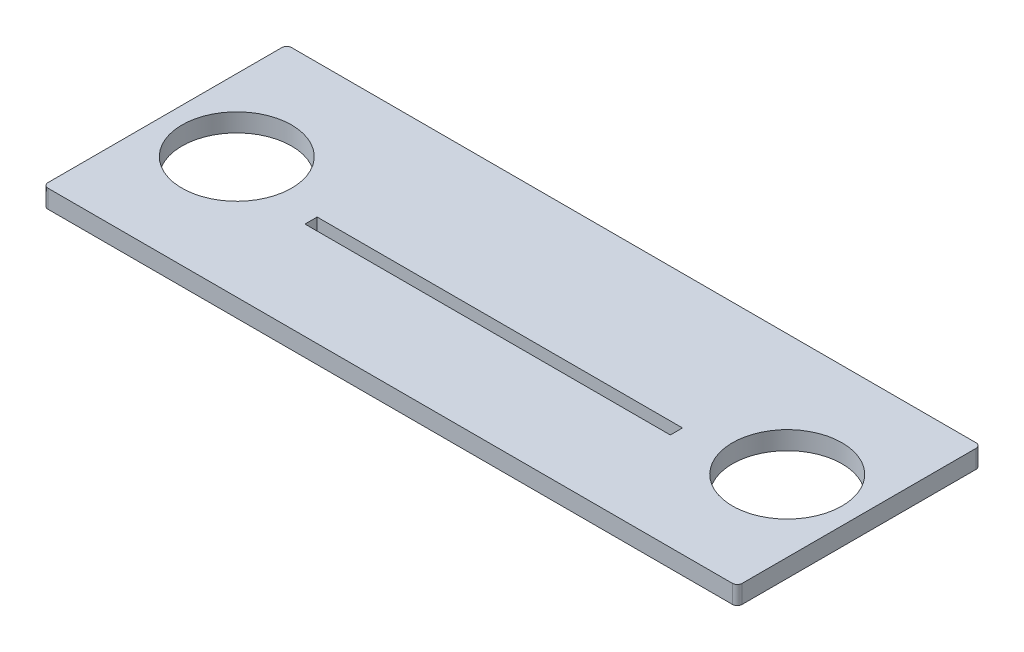
ISO-10303-21;
HEADER;
FILE_DESCRIPTION(('STEP AP214'),'2;1');
FILE_NAME('part.step','',(''),(''),'','','');
FILE_SCHEMA(('AUTOMOTIVE_DESIGN { 1 0 10303 214 1 1 1 1 }'));
ENDSEC;
DATA;
#1=APPLICATION_CONTEXT('core data for automotive mechanical design processes');
#2=APPLICATION_PROTOCOL_DEFINITION('international standard','automotive_design',2000,#1);
#3=PRODUCT_CONTEXT('',#1,'mechanical');
#4=PRODUCT('Part','Part','',(#3));
#5=PRODUCT_RELATED_PRODUCT_CATEGORY('part','',(#4));
#6=PRODUCT_DEFINITION_FORMATION('','',#4);
#7=PRODUCT_DEFINITION_CONTEXT('part definition',#1,'design');
#8=PRODUCT_DEFINITION('design','',#6,#7);
#9=PRODUCT_DEFINITION_SHAPE('','',#8);
#10=(LENGTH_UNIT() NAMED_UNIT(*) SI_UNIT(.MILLI.,.METRE.));
#11=(NAMED_UNIT(*) PLANE_ANGLE_UNIT() SI_UNIT($,.RADIAN.));
#12=(NAMED_UNIT(*) SI_UNIT($,.STERADIAN.) SOLID_ANGLE_UNIT());
#13=UNCERTAINTY_MEASURE_WITH_UNIT(LENGTH_MEASURE(1.E-05),#10,'distance_accuracy_value','');
#14=(GEOMETRIC_REPRESENTATION_CONTEXT(3) GLOBAL_UNCERTAINTY_ASSIGNED_CONTEXT((#13)) GLOBAL_UNIT_ASSIGNED_CONTEXT((#10,
#11,#12)) REPRESENTATION_CONTEXT('',''));
#15=CARTESIAN_POINT('',(0.,0.,0.));
#16=DIRECTION('',(0.,0.,1.));
#17=DIRECTION('',(1.,0.,0.));
#18=AXIS2_PLACEMENT_3D('',#15,#16,#17);
#19=CARTESIAN_POINT('',(0.,7.5,0.));
#20=DIRECTION('',(0.,-1.,0.));
#21=DIRECTION('',(0.,0.,-1.));
#22=AXIS2_PLACEMENT_3D('',#19,#20,#21);
#23=PLANE('',#22);
#24=CARTESIAN_POINT('',(113.,7.5,0.));
#25=DIRECTION('',(0.,-1.,0.));
#26=DIRECTION('',(0.,0.,-1.));
#27=AXIS2_PLACEMENT_3D('',#24,#25,#26);
#28=CIRCLE('',#27,22.5);
#29=CARTESIAN_POINT('',(113.,7.5,-22.5));
#30=VERTEX_POINT('',#29);
#31=EDGE_CURVE('E168',#30,#30,#28,.F.);
#32=ORIENTED_EDGE('',*,*,#31,.F.);
#33=EDGE_LOOP('',(#32));
#34=FACE_BOUND('',#33,.T.);
#35=CARTESIAN_POINT('',(-113.,7.5,0.));
#36=DIRECTION('',(0.,-1.,0.));
#37=DIRECTION('',(0.,0.,-1.));
#38=AXIS2_PLACEMENT_3D('',#35,#36,#37);
#39=CIRCLE('',#38,22.5);
#40=CARTESIAN_POINT('',(-113.,7.5,-22.5));
#41=VERTEX_POINT('',#40);
#42=EDGE_CURVE('E224',#41,#41,#39,.F.);
#43=ORIENTED_EDGE('',*,*,#42,.F.);
#44=EDGE_LOOP('',(#43));
#45=FACE_BOUND('',#44,.T.);
#46=DIRECTION('',(0.,0.,-1.));
#47=VECTOR('',#46,1.);
#48=CARTESIAN_POINT('',(142.5,7.5,50.));
#49=LINE('',#48,#47);
#50=CARTESIAN_POINT('',(142.5,7.5,48.));
#51=VERTEX_POINT('',#50);
#52=CARTESIAN_POINT('',(142.5,7.5,-48.));
#53=VERTEX_POINT('',#52);
#54=EDGE_CURVE('E217',#51,#53,#49,.T.);
#55=ORIENTED_EDGE('',*,*,#54,.T.);
#56=CARTESIAN_POINT('',(140.5,7.5,-48.));
#57=DIRECTION('',(0.,-1.,0.));
#58=DIRECTION('',(0.,0.,-1.));
#59=AXIS2_PLACEMENT_3D('',#56,#57,#58);
#60=CIRCLE('',#59,2.);
#61=CARTESIAN_POINT('',(140.5,7.5,-50.));
#62=VERTEX_POINT('',#61);
#63=EDGE_CURVE('E192',#53,#62,#60,.F.);
#64=ORIENTED_EDGE('',*,*,#63,.T.);
#65=DIRECTION('',(-1.,0.,0.));
#66=VECTOR('',#65,1.);
#67=CARTESIAN_POINT('',(-142.5,7.5,-50.));
#68=LINE('',#67,#66);
#69=CARTESIAN_POINT('',(-140.5,7.5,-50.));
#70=VERTEX_POINT('',#69);
#71=EDGE_CURVE('E246',#62,#70,#68,.T.);
#72=ORIENTED_EDGE('',*,*,#71,.T.);
#73=CARTESIAN_POINT('',(-140.5,7.5,-48.));
#74=DIRECTION('',(0.,-1.,0.));
#75=DIRECTION('',(0.,0.,-1.));
#76=AXIS2_PLACEMENT_3D('',#73,#74,#75);
#77=CIRCLE('',#76,2.);
#78=CARTESIAN_POINT('',(-142.5,7.5,-48.));
#79=VERTEX_POINT('',#78);
#80=EDGE_CURVE('E187',#70,#79,#77,.F.);
#81=ORIENTED_EDGE('',*,*,#80,.T.);
#82=DIRECTION('',(0.,0.,1.));
#83=VECTOR('',#82,1.);
#84=CARTESIAN_POINT('',(-142.5,7.5,50.));
#85=LINE('',#84,#83);
#86=CARTESIAN_POINT('',(-142.5,7.5,48.));
#87=VERTEX_POINT('',#86);
#88=EDGE_CURVE('E206',#79,#87,#85,.T.);
#89=ORIENTED_EDGE('',*,*,#88,.T.);
#90=CARTESIAN_POINT('',(-140.5,7.5,48.));
#91=DIRECTION('',(0.,-1.,0.));
#92=DIRECTION('',(0.,0.,-1.));
#93=AXIS2_PLACEMENT_3D('',#90,#91,#92);
#94=CIRCLE('',#93,2.);
#95=CARTESIAN_POINT('',(-140.5,7.5,50.));
#96=VERTEX_POINT('',#95);
#97=EDGE_CURVE('E65',#87,#96,#94,.F.);
#98=ORIENTED_EDGE('',*,*,#97,.T.);
#99=DIRECTION('',(1.,0.,0.));
#100=VECTOR('',#99,1.);
#101=CARTESIAN_POINT('',(-142.5,7.5,50.));
#102=LINE('',#101,#100);
#103=CARTESIAN_POINT('',(140.5,7.5,50.));
#104=VERTEX_POINT('',#103);
#105=EDGE_CURVE('E144',#96,#104,#102,.T.);
#106=ORIENTED_EDGE('',*,*,#105,.T.);
#107=CARTESIAN_POINT('',(140.5,7.5,48.));
#108=DIRECTION('',(0.,-1.,0.));
#109=DIRECTION('',(0.,0.,-1.));
#110=AXIS2_PLACEMENT_3D('',#107,#108,#109);
#111=CIRCLE('',#110,2.);
#112=EDGE_CURVE('E190',#104,#51,#111,.F.);
#113=ORIENTED_EDGE('',*,*,#112,.T.);
#114=EDGE_LOOP('',(#55,#64,#72,#81,#89,#98,#106,#113));
#115=FACE_BOUND('',#114,.T.);
#116=DIRECTION('',(0.,0.,-1.));
#117=VECTOR('',#116,1.);
#118=CARTESIAN_POINT('',(-75.,7.5,0.));
#119=LINE('',#118,#117);
#120=CARTESIAN_POINT('',(-75.,7.5,10.));
#121=VERTEX_POINT('',#120);
#122=CARTESIAN_POINT('',(-75.,7.5,5.));
#123=VERTEX_POINT('',#122);
#124=EDGE_CURVE('E237',#121,#123,#119,.T.);
#125=ORIENTED_EDGE('',*,*,#124,.T.);
#126=DIRECTION('',(1.,0.,0.));
#127=VECTOR('',#126,1.);
#128=CARTESIAN_POINT('',(0.,7.5,5.));
#129=LINE('',#128,#127);
#130=CARTESIAN_POINT('',(75.,7.5,5.));
#131=VERTEX_POINT('',#130);
#132=EDGE_CURVE('E169',#123,#131,#129,.T.);
#133=ORIENTED_EDGE('',*,*,#132,.T.);
#134=DIRECTION('',(0.,0.,-1.));
#135=VECTOR('',#134,1.);
#136=CARTESIAN_POINT('',(75.,7.5,0.));
#137=LINE('',#136,#135);
#138=CARTESIAN_POINT('',(75.,7.5,10.));
#139=VERTEX_POINT('',#138);
#140=EDGE_CURVE('E227',#139,#131,#137,.T.);
#141=ORIENTED_EDGE('',*,*,#140,.F.);
#142=DIRECTION('',(1.,0.,0.));
#143=VECTOR('',#142,1.);
#144=CARTESIAN_POINT('',(0.,7.5,10.));
#145=LINE('',#144,#143);
#146=EDGE_CURVE('E151',#121,#139,#145,.T.);
#147=ORIENTED_EDGE('',*,*,#146,.F.);
#148=EDGE_LOOP('',(#125,#133,#141,#147));
#149=FACE_BOUND('',#148,.T.);
#150=ADVANCED_FACE('F43',(#34,#45,#115,#149),#23,.F.);
#151=CARTESIAN_POINT('',(0.,0.,0.));
#152=DIRECTION('',(0.,-1.,0.));
#153=DIRECTION('',(0.,0.,-1.));
#154=AXIS2_PLACEMENT_3D('',#151,#152,#153);
#155=PLANE('',#154);
#156=CARTESIAN_POINT('',(113.,0.,0.));
#157=DIRECTION('',(0.,-1.,0.));
#158=DIRECTION('',(0.,0.,-1.));
#159=AXIS2_PLACEMENT_3D('',#156,#157,#158);
#160=CIRCLE('',#159,22.5);
#161=CARTESIAN_POINT('',(113.,0.,-22.5));
#162=VERTEX_POINT('',#161);
#163=EDGE_CURVE('E165',#162,#162,#160,.F.);
#164=ORIENTED_EDGE('',*,*,#163,.T.);
#165=EDGE_LOOP('',(#164));
#166=FACE_BOUND('',#165,.T.);
#167=DIRECTION('',(-1.,0.,0.));
#168=VECTOR('',#167,1.);
#169=CARTESIAN_POINT('',(-142.5,0.,-50.));
#170=LINE('',#169,#168);
#171=CARTESIAN_POINT('',(140.5,0.,-50.));
#172=VERTEX_POINT('',#171);
#173=CARTESIAN_POINT('',(-140.5,0.,-50.));
#174=VERTEX_POINT('',#173);
#175=EDGE_CURVE('E215',#172,#174,#170,.T.);
#176=ORIENTED_EDGE('',*,*,#175,.F.);
#177=CARTESIAN_POINT('',(140.5,0.,-48.));
#178=DIRECTION('',(0.,-1.,0.));
#179=DIRECTION('',(0.,0.,-1.));
#180=AXIS2_PLACEMENT_3D('',#177,#178,#179);
#181=CIRCLE('',#180,2.);
#182=CARTESIAN_POINT('',(142.5,0.,-48.));
#183=VERTEX_POINT('',#182);
#184=EDGE_CURVE('E180',#172,#183,#181,.T.);
#185=ORIENTED_EDGE('',*,*,#184,.T.);
#186=DIRECTION('',(0.,0.,-1.));
#187=VECTOR('',#186,1.);
#188=CARTESIAN_POINT('',(142.5,0.,50.));
#189=LINE('',#188,#187);
#190=CARTESIAN_POINT('',(142.5,0.,48.));
#191=VERTEX_POINT('',#190);
#192=EDGE_CURVE('E219',#191,#183,#189,.T.);
#193=ORIENTED_EDGE('',*,*,#192,.F.);
#194=CARTESIAN_POINT('',(140.5,0.,48.));
#195=DIRECTION('',(0.,-1.,0.));
#196=DIRECTION('',(0.,0.,-1.));
#197=AXIS2_PLACEMENT_3D('',#194,#195,#196);
#198=CIRCLE('',#197,2.);
#199=CARTESIAN_POINT('',(140.5,0.,50.));
#200=VERTEX_POINT('',#199);
#201=EDGE_CURVE('E178',#191,#200,#198,.T.);
#202=ORIENTED_EDGE('',*,*,#201,.T.);
#203=DIRECTION('',(1.,0.,0.));
#204=VECTOR('',#203,1.);
#205=CARTESIAN_POINT('',(-142.5,0.,50.));
#206=LINE('',#205,#204);
#207=CARTESIAN_POINT('',(-140.5,0.,50.));
#208=VERTEX_POINT('',#207);
#209=EDGE_CURVE('E214',#208,#200,#206,.T.);
#210=ORIENTED_EDGE('',*,*,#209,.F.);
#211=CARTESIAN_POINT('',(-140.5,0.,48.));
#212=DIRECTION('',(0.,-1.,0.));
#213=DIRECTION('',(0.,0.,-1.));
#214=AXIS2_PLACEMENT_3D('',#211,#212,#213);
#215=CIRCLE('',#214,2.);
#216=CARTESIAN_POINT('',(-142.5,0.,48.));
#217=VERTEX_POINT('',#216);
#218=EDGE_CURVE('E176',#208,#217,#215,.T.);
#219=ORIENTED_EDGE('',*,*,#218,.T.);
#220=DIRECTION('',(0.,0.,1.));
#221=VECTOR('',#220,1.);
#222=CARTESIAN_POINT('',(-142.5,0.,50.));
#223=LINE('',#222,#221);
#224=CARTESIAN_POINT('',(-142.5,0.,-48.));
#225=VERTEX_POINT('',#224);
#226=EDGE_CURVE('E204',#225,#217,#223,.T.);
#227=ORIENTED_EDGE('',*,*,#226,.F.);
#228=CARTESIAN_POINT('',(-140.5,0.,-48.));
#229=DIRECTION('',(0.,-1.,0.));
#230=DIRECTION('',(0.,0.,-1.));
#231=AXIS2_PLACEMENT_3D('',#228,#229,#230);
#232=CIRCLE('',#231,2.);
#233=EDGE_CURVE('E174',#225,#174,#232,.T.);
#234=ORIENTED_EDGE('',*,*,#233,.T.);
#235=EDGE_LOOP('',(#176,#185,#193,#202,#210,#219,#227,#234));
#236=FACE_BOUND('',#235,.T.);
#237=CARTESIAN_POINT('',(-113.,0.,0.));
#238=DIRECTION('',(0.,-1.,0.));
#239=DIRECTION('',(0.,0.,-1.));
#240=AXIS2_PLACEMENT_3D('',#237,#238,#239);
#241=CIRCLE('',#240,22.5);
#242=CARTESIAN_POINT('',(-113.,0.,-22.5));
#243=VERTEX_POINT('',#242);
#244=EDGE_CURVE('E222',#243,#243,#241,.F.);
#245=ORIENTED_EDGE('',*,*,#244,.T.);
#246=EDGE_LOOP('',(#245));
#247=FACE_BOUND('',#246,.T.);
#248=DIRECTION('',(1.,0.,0.));
#249=VECTOR('',#248,1.);
#250=CARTESIAN_POINT('',(0.,0.,5.));
#251=LINE('',#250,#249);
#252=CARTESIAN_POINT('',(-75.,0.,5.));
#253=VERTEX_POINT('',#252);
#254=CARTESIAN_POINT('',(75.,0.,5.));
#255=VERTEX_POINT('',#254);
#256=EDGE_CURVE('E159',#253,#255,#251,.T.);
#257=ORIENTED_EDGE('',*,*,#256,.F.);
#258=DIRECTION('',(0.,0.,-1.));
#259=VECTOR('',#258,1.);
#260=CARTESIAN_POINT('',(-75.,0.,0.));
#261=LINE('',#260,#259);
#262=CARTESIAN_POINT('',(-75.,0.,10.));
#263=VERTEX_POINT('',#262);
#264=EDGE_CURVE('E157',#263,#253,#261,.T.);
#265=ORIENTED_EDGE('',*,*,#264,.F.);
#266=DIRECTION('',(1.,0.,0.));
#267=VECTOR('',#266,1.);
#268=CARTESIAN_POINT('',(0.,0.,10.));
#269=LINE('',#268,#267);
#270=CARTESIAN_POINT('',(75.,0.,10.));
#271=VERTEX_POINT('',#270);
#272=EDGE_CURVE('E143',#263,#271,#269,.T.);
#273=ORIENTED_EDGE('',*,*,#272,.T.);
#274=DIRECTION('',(0.,0.,-1.));
#275=VECTOR('',#274,1.);
#276=CARTESIAN_POINT('',(75.,0.,0.));
#277=LINE('',#276,#275);
#278=EDGE_CURVE('E132',#271,#255,#277,.T.);
#279=ORIENTED_EDGE('',*,*,#278,.T.);
#280=EDGE_LOOP('',(#257,#265,#273,#279));
#281=FACE_BOUND('',#280,.T.);
#282=ADVANCED_FACE('F156',(#166,#236,#247,#281),#155,.T.);
#283=CARTESIAN_POINT('',(142.5,7.5,50.));
#284=DIRECTION('',(-1.,0.,0.));
#285=DIRECTION('',(0.,0.,1.));
#286=AXIS2_PLACEMENT_3D('',#283,#284,#285);
#287=PLANE('',#286);
#288=ORIENTED_EDGE('',*,*,#192,.T.);
#289=DIRECTION('',(0.,-1.,0.));
#290=VECTOR('',#289,1.);
#291=CARTESIAN_POINT('',(142.5,7.5,-48.));
#292=LINE('',#291,#290);
#293=EDGE_CURVE('E185',#183,#53,#292,.F.);
#294=ORIENTED_EDGE('',*,*,#293,.T.);
#295=ORIENTED_EDGE('',*,*,#54,.F.);
#296=DIRECTION('',(0.,-1.,0.));
#297=VECTOR('',#296,1.);
#298=CARTESIAN_POINT('',(142.5,7.5,48.));
#299=LINE('',#298,#297);
#300=EDGE_CURVE('E182',#51,#191,#299,.T.);
#301=ORIENTED_EDGE('',*,*,#300,.T.);
#302=EDGE_LOOP('',(#288,#294,#295,#301));
#303=FACE_BOUND('',#302,.T.);
#304=ADVANCED_FACE('F254',(#303),#287,.F.);
#305=CARTESIAN_POINT('',(-142.5,7.5,-50.));
#306=DIRECTION('',(0.,0.,1.));
#307=DIRECTION('',(1.,0.,0.));
#308=AXIS2_PLACEMENT_3D('',#305,#306,#307);
#309=PLANE('',#308);
#310=ORIENTED_EDGE('',*,*,#71,.F.);
#311=DIRECTION('',(0.,-1.,0.));
#312=VECTOR('',#311,1.);
#313=CARTESIAN_POINT('',(140.5,7.5,-50.));
#314=LINE('',#313,#312);
#315=EDGE_CURVE('E171',#62,#172,#314,.T.);
#316=ORIENTED_EDGE('',*,*,#315,.T.);
#317=ORIENTED_EDGE('',*,*,#175,.T.);
#318=DIRECTION('',(0.,-1.,0.));
#319=VECTOR('',#318,1.);
#320=CARTESIAN_POINT('',(-140.5,7.5,-50.));
#321=LINE('',#320,#319);
#322=EDGE_CURVE('E164',#174,#70,#321,.F.);
#323=ORIENTED_EDGE('',*,*,#322,.T.);
#324=EDGE_LOOP('',(#310,#316,#317,#323));
#325=FACE_BOUND('',#324,.T.);
#326=ADVANCED_FACE('F264',(#325),#309,.F.);
#327=CARTESIAN_POINT('',(-142.5,7.5,50.));
#328=DIRECTION('',(1.,0.,0.));
#329=DIRECTION('',(0.,0.,-1.));
#330=AXIS2_PLACEMENT_3D('',#327,#328,#329);
#331=PLANE('',#330);
#332=ORIENTED_EDGE('',*,*,#226,.T.);
#333=DIRECTION('',(0.,-1.,0.));
#334=VECTOR('',#333,1.);
#335=CARTESIAN_POINT('',(-142.5,7.5,48.));
#336=LINE('',#335,#334);
#337=EDGE_CURVE('E11',#217,#87,#336,.F.);
#338=ORIENTED_EDGE('',*,*,#337,.T.);
#339=ORIENTED_EDGE('',*,*,#88,.F.);
#340=DIRECTION('',(0.,-1.,0.));
#341=VECTOR('',#340,1.);
#342=CARTESIAN_POINT('',(-142.5,7.5,-48.));
#343=LINE('',#342,#341);
#344=EDGE_CURVE('E51',#79,#225,#343,.T.);
#345=ORIENTED_EDGE('',*,*,#344,.T.);
#346=EDGE_LOOP('',(#332,#338,#339,#345));
#347=FACE_BOUND('',#346,.T.);
#348=ADVANCED_FACE('F203',(#347),#331,.F.);
#349=CARTESIAN_POINT('',(-142.5,7.5,50.));
#350=DIRECTION('',(0.,0.,-1.));
#351=DIRECTION('',(-1.,0.,0.));
#352=AXIS2_PLACEMENT_3D('',#349,#350,#351);
#353=PLANE('',#352);
#354=ORIENTED_EDGE('',*,*,#209,.T.);
#355=DIRECTION('',(0.,-1.,0.));
#356=VECTOR('',#355,1.);
#357=CARTESIAN_POINT('',(140.5,7.5,50.));
#358=LINE('',#357,#356);
#359=EDGE_CURVE('E58',#200,#104,#358,.F.);
#360=ORIENTED_EDGE('',*,*,#359,.T.);
#361=ORIENTED_EDGE('',*,*,#105,.F.);
#362=DIRECTION('',(0.,-1.,0.));
#363=VECTOR('',#362,1.);
#364=CARTESIAN_POINT('',(-140.5,7.5,50.));
#365=LINE('',#364,#363);
#366=EDGE_CURVE('E194',#96,#208,#365,.T.);
#367=ORIENTED_EDGE('',*,*,#366,.T.);
#368=EDGE_LOOP('',(#354,#360,#361,#367));
#369=FACE_BOUND('',#368,.T.);
#370=ADVANCED_FACE('F269',(#369),#353,.F.);
#371=CARTESIAN_POINT('',(-113.,7.500012,0.));
#372=DIRECTION('',(0.,-1.,0.));
#373=DIRECTION('',(0.,0.,-1.));
#374=AXIS2_PLACEMENT_3D('',#371,#372,#373);
#375=CYLINDRICAL_SURFACE('',#374,22.5);
#376=CARTESIAN_POINT('',(-113.,0.,-22.5));
#377=CARTESIAN_POINT('',(-113.,0.0781250000000002,-22.5));
#378=CARTESIAN_POINT('',(-113.,0.15625,-22.5));
#379=CARTESIAN_POINT('',(-113.,0.3125,-22.5));
#380=CARTESIAN_POINT('',(-113.,0.390625,-22.5));
#381=CARTESIAN_POINT('',(-113.,0.546875,-22.5));
#382=CARTESIAN_POINT('',(-113.,0.625000000000001,-22.5));
#383=CARTESIAN_POINT('',(-113.,0.78125,-22.5));
#384=CARTESIAN_POINT('',(-113.,0.859375,-22.5));
#385=CARTESIAN_POINT('',(-113.,1.015625,-22.5));
#386=CARTESIAN_POINT('',(-113.,1.09375,-22.5));
#387=CARTESIAN_POINT('',(-113.,1.25,-22.5));
#388=CARTESIAN_POINT('',(-113.,1.328125,-22.5));
#389=CARTESIAN_POINT('',(-113.,1.484375,-22.5));
#390=CARTESIAN_POINT('',(-113.,1.5625,-22.5));
#391=CARTESIAN_POINT('',(-113.,1.71875,-22.5));
#392=CARTESIAN_POINT('',(-113.,1.796875,-22.5));
#393=CARTESIAN_POINT('',(-113.,1.953125,-22.5));
#394=CARTESIAN_POINT('',(-113.,2.03125,-22.5));
#395=CARTESIAN_POINT('',(-113.,2.1875,-22.5));
#396=CARTESIAN_POINT('',(-113.,2.265625,-22.5));
#397=CARTESIAN_POINT('',(-113.,2.421875,-22.5));
#398=CARTESIAN_POINT('',(-113.,2.5,-22.5));
#399=CARTESIAN_POINT('',(-113.,2.65625,-22.5));
#400=CARTESIAN_POINT('',(-113.,2.734375,-22.5));
#401=CARTESIAN_POINT('',(-113.,2.890625,-22.5));
#402=CARTESIAN_POINT('',(-113.,2.96875,-22.5));
#403=CARTESIAN_POINT('',(-113.,3.125,-22.5));
#404=CARTESIAN_POINT('',(-113.,3.203125,-22.5));
#405=CARTESIAN_POINT('',(-113.,3.359375,-22.5));
#406=CARTESIAN_POINT('',(-113.,3.4375,-22.5));
#407=CARTESIAN_POINT('',(-113.,3.59375,-22.5));
#408=CARTESIAN_POINT('',(-113.,3.671875,-22.5));
#409=CARTESIAN_POINT('',(-113.,3.828125,-22.5));
#410=CARTESIAN_POINT('',(-113.,3.90625,-22.5));
#411=CARTESIAN_POINT('',(-113.,4.0625,-22.5));
#412=CARTESIAN_POINT('',(-113.,4.140625,-22.5));
#413=CARTESIAN_POINT('',(-113.,4.296875,-22.5));
#414=CARTESIAN_POINT('',(-113.,4.375,-22.5));
#415=CARTESIAN_POINT('',(-113.,4.53125,-22.5));
#416=CARTESIAN_POINT('',(-113.,4.609375,-22.5));
#417=CARTESIAN_POINT('',(-113.,4.765625,-22.5));
#418=CARTESIAN_POINT('',(-113.,4.84375,-22.5));
#419=CARTESIAN_POINT('',(-113.,5.,-22.5));
#420=CARTESIAN_POINT('',(-113.,5.078125,-22.5));
#421=CARTESIAN_POINT('',(-113.,5.234375,-22.5));
#422=CARTESIAN_POINT('',(-113.,5.3125,-22.5));
#423=CARTESIAN_POINT('',(-113.,5.46875,-22.5));
#424=CARTESIAN_POINT('',(-113.,5.546875,-22.5));
#425=CARTESIAN_POINT('',(-113.,5.703125,-22.5));
#426=CARTESIAN_POINT('',(-113.,5.78125,-22.5));
#427=CARTESIAN_POINT('',(-113.,5.9375,-22.5));
#428=CARTESIAN_POINT('',(-113.,6.015625,-22.5));
#429=CARTESIAN_POINT('',(-113.,6.171875,-22.5));
#430=CARTESIAN_POINT('',(-113.,6.25,-22.5));
#431=CARTESIAN_POINT('',(-113.,6.40625,-22.5));
#432=CARTESIAN_POINT('',(-113.,6.484375,-22.5));
#433=CARTESIAN_POINT('',(-113.,6.640625,-22.5));
#434=CARTESIAN_POINT('',(-113.,6.71875,-22.5));
#435=CARTESIAN_POINT('',(-113.,6.875,-22.5));
#436=CARTESIAN_POINT('',(-113.,6.953125,-22.5));
#437=CARTESIAN_POINT('',(-113.,7.109375,-22.5));
#438=CARTESIAN_POINT('',(-113.,7.1875,-22.5));
#439=CARTESIAN_POINT('',(-113.,7.34375,-22.5));
#440=CARTESIAN_POINT('',(-113.,7.421875,-22.5));
#441=CARTESIAN_POINT('',(-113.,7.5,-22.5));
#442=B_SPLINE_CURVE_WITH_KNOTS('',3,(#376,#377,#378,#379,#380,#381,#382,#383,#384,#385,#386,
#387,#388,#389,#390,#391,#392,#393,#394,#395,#396,#397,#398,#399,#400,#401,#402,#403,#404,#405,
#406,#407,#408,#409,#410,#411,#412,#413,#414,#415,#416,#417,#418,#419,#420,#421,#422,#423,#424,
#425,#426,#427,#428,#429,#430,#431,#432,#433,#434,#435,#436,#437,#438,#439,#440,#441),
.UNSPECIFIED.,.F.,.F.,(4,2,2,2,2,2,2,2,2,2,2,2,2,2,2,2,2,2,2,2,2,2,2,2,2,2,2,2,2,2,2,2,4),(0.,
0.234375,0.46875,0.703125000000001,0.9375,1.171875,1.40625,1.640625,1.875,2.109375,2.34375,
2.578125,2.8125,3.046875,3.28125,3.515625,3.75,3.984375,4.21875,4.453125,4.6875,4.921875,
5.15625,5.390625,5.625,5.859375,6.09375,6.328125,6.5625,6.796875,7.03125,7.265625,7.5),.UNSPECIFIED.);
#443=EDGE_CURVE('BSEAM293',#243,#41,#442,.T.);
#444=ORIENTED_EDGE('',*,*,#244,.F.);
#445=ORIENTED_EDGE('',*,*,#42,.T.);
#446=ORIENTED_EDGE('',*,*,#443,.T.);
#447=ORIENTED_EDGE('',*,*,#443,.F.);
#448=EDGE_LOOP('',(#444,#446,#445,#447));
#449=FACE_BOUND('',#448,.T.);
#450=ADVANCED_FACE('F293',(#449),#375,.F.);
#451=CARTESIAN_POINT('',(-75.,7.500012,5.));
#452=DIRECTION('',(0.,0.,-1.));
#453=DIRECTION('',(-1.,0.,0.));
#454=AXIS2_PLACEMENT_3D('',#451,#452,#453);
#455=PLANE('',#454);
#456=DIRECTION('',(0.,-1.,0.));
#457=VECTOR('',#456,1.);
#458=CARTESIAN_POINT('',(-75.,7.500012,5.));
#459=LINE('',#458,#457);
#460=EDGE_CURVE('E232',#123,#253,#459,.T.);
#461=ORIENTED_EDGE('',*,*,#460,.T.);
#462=ORIENTED_EDGE('',*,*,#256,.T.);
#463=DIRECTION('',(0.,-1.,0.));
#464=VECTOR('',#463,1.);
#465=CARTESIAN_POINT('',(75.,7.500012,5.));
#466=LINE('',#465,#464);
#467=EDGE_CURVE('E138',#131,#255,#466,.T.);
#468=ORIENTED_EDGE('',*,*,#467,.F.);
#469=ORIENTED_EDGE('',*,*,#132,.F.);
#470=EDGE_LOOP('',(#461,#462,#468,#469));
#471=FACE_BOUND('',#470,.T.);
#472=ADVANCED_FACE('F380',(#471),#455,.F.);
#473=CARTESIAN_POINT('',(-75.,7.500012,10.));
#474=DIRECTION('',(-1.,0.,0.));
#475=DIRECTION('',(0.,0.,1.));
#476=AXIS2_PLACEMENT_3D('',#473,#474,#475);
#477=PLANE('',#476);
#478=DIRECTION('',(0.,-1.,0.));
#479=VECTOR('',#478,1.);
#480=CARTESIAN_POINT('',(-75.,7.500012,10.));
#481=LINE('',#480,#479);
#482=EDGE_CURVE('E153',#121,#263,#481,.T.);
#483=ORIENTED_EDGE('',*,*,#482,.T.);
#484=ORIENTED_EDGE('',*,*,#264,.T.);
#485=ORIENTED_EDGE('',*,*,#460,.F.);
#486=ORIENTED_EDGE('',*,*,#124,.F.);
#487=EDGE_LOOP('',(#483,#484,#485,#486));
#488=FACE_BOUND('',#487,.T.);
#489=ADVANCED_FACE('F371',(#488),#477,.F.);
#490=CARTESIAN_POINT('',(-75.,7.500012,10.));
#491=DIRECTION('',(0.,0.,-1.));
#492=DIRECTION('',(-1.,0.,0.));
#493=AXIS2_PLACEMENT_3D('',#490,#491,#492);
#494=PLANE('',#493);
#495=ORIENTED_EDGE('',*,*,#146,.T.);
#496=DIRECTION('',(0.,-1.,0.));
#497=VECTOR('',#496,1.);
#498=CARTESIAN_POINT('',(75.,7.500012,10.));
#499=LINE('',#498,#497);
#500=EDGE_CURVE('E135',#139,#271,#499,.T.);
#501=ORIENTED_EDGE('',*,*,#500,.T.);
#502=ORIENTED_EDGE('',*,*,#272,.F.);
#503=ORIENTED_EDGE('',*,*,#482,.F.);
#504=EDGE_LOOP('',(#495,#501,#502,#503));
#505=FACE_BOUND('',#504,.T.);
#506=ADVANCED_FACE('F147',(#505),#494,.T.);
#507=CARTESIAN_POINT('',(75.,7.500012,10.));
#508=DIRECTION('',(-1.,0.,0.));
#509=DIRECTION('',(0.,0.,1.));
#510=AXIS2_PLACEMENT_3D('',#507,#508,#509);
#511=PLANE('',#510);
#512=ORIENTED_EDGE('',*,*,#140,.T.);
#513=ORIENTED_EDGE('',*,*,#467,.T.);
#514=ORIENTED_EDGE('',*,*,#278,.F.);
#515=ORIENTED_EDGE('',*,*,#500,.F.);
#516=EDGE_LOOP('',(#512,#513,#514,#515));
#517=FACE_BOUND('',#516,.T.);
#518=ADVANCED_FACE('F134',(#517),#511,.T.);
#519=CARTESIAN_POINT('',(113.,7.500012,0.));
#520=DIRECTION('',(0.,-1.,0.));
#521=DIRECTION('',(0.,0.,-1.));
#522=AXIS2_PLACEMENT_3D('',#519,#520,#521);
#523=CYLINDRICAL_SURFACE('',#522,22.5);
#524=CARTESIAN_POINT('',(113.,0.,-22.5));
#525=CARTESIAN_POINT('',(113.,0.0781250000000002,-22.5));
#526=CARTESIAN_POINT('',(113.,0.15625,-22.5));
#527=CARTESIAN_POINT('',(113.,0.3125,-22.5));
#528=CARTESIAN_POINT('',(113.,0.390625,-22.5));
#529=CARTESIAN_POINT('',(113.,0.546875,-22.5));
#530=CARTESIAN_POINT('',(113.,0.625000000000001,-22.5));
#531=CARTESIAN_POINT('',(113.,0.78125,-22.5));
#532=CARTESIAN_POINT('',(113.,0.859375,-22.5));
#533=CARTESIAN_POINT('',(113.,1.015625,-22.5));
#534=CARTESIAN_POINT('',(113.,1.09375,-22.5));
#535=CARTESIAN_POINT('',(113.,1.25,-22.5));
#536=CARTESIAN_POINT('',(113.,1.328125,-22.5));
#537=CARTESIAN_POINT('',(113.,1.484375,-22.5));
#538=CARTESIAN_POINT('',(113.,1.5625,-22.5));
#539=CARTESIAN_POINT('',(113.,1.71875,-22.5));
#540=CARTESIAN_POINT('',(113.,1.796875,-22.5));
#541=CARTESIAN_POINT('',(113.,1.953125,-22.5));
#542=CARTESIAN_POINT('',(113.,2.03125,-22.5));
#543=CARTESIAN_POINT('',(113.,2.1875,-22.5));
#544=CARTESIAN_POINT('',(113.,2.265625,-22.5));
#545=CARTESIAN_POINT('',(113.,2.421875,-22.5));
#546=CARTESIAN_POINT('',(113.,2.5,-22.5));
#547=CARTESIAN_POINT('',(113.,2.65625,-22.5));
#548=CARTESIAN_POINT('',(113.,2.734375,-22.5));
#549=CARTESIAN_POINT('',(113.,2.890625,-22.5));
#550=CARTESIAN_POINT('',(113.,2.96875,-22.5));
#551=CARTESIAN_POINT('',(113.,3.125,-22.5));
#552=CARTESIAN_POINT('',(113.,3.203125,-22.5));
#553=CARTESIAN_POINT('',(113.,3.359375,-22.5));
#554=CARTESIAN_POINT('',(113.,3.4375,-22.5));
#555=CARTESIAN_POINT('',(113.,3.59375,-22.5));
#556=CARTESIAN_POINT('',(113.,3.671875,-22.5));
#557=CARTESIAN_POINT('',(113.,3.828125,-22.5));
#558=CARTESIAN_POINT('',(113.,3.90625,-22.5));
#559=CARTESIAN_POINT('',(113.,4.0625,-22.5));
#560=CARTESIAN_POINT('',(113.,4.140625,-22.5));
#561=CARTESIAN_POINT('',(113.,4.296875,-22.5));
#562=CARTESIAN_POINT('',(113.,4.375,-22.5));
#563=CARTESIAN_POINT('',(113.,4.53125,-22.5));
#564=CARTESIAN_POINT('',(113.,4.609375,-22.5));
#565=CARTESIAN_POINT('',(113.,4.765625,-22.5));
#566=CARTESIAN_POINT('',(113.,4.84375,-22.5));
#567=CARTESIAN_POINT('',(113.,5.,-22.5));
#568=CARTESIAN_POINT('',(113.,5.078125,-22.5));
#569=CARTESIAN_POINT('',(113.,5.234375,-22.5));
#570=CARTESIAN_POINT('',(113.,5.3125,-22.5));
#571=CARTESIAN_POINT('',(113.,5.46875,-22.5));
#572=CARTESIAN_POINT('',(113.,5.546875,-22.5));
#573=CARTESIAN_POINT('',(113.,5.703125,-22.5));
#574=CARTESIAN_POINT('',(113.,5.78125,-22.5));
#575=CARTESIAN_POINT('',(113.,5.9375,-22.5));
#576=CARTESIAN_POINT('',(113.,6.015625,-22.5));
#577=CARTESIAN_POINT('',(113.,6.171875,-22.5));
#578=CARTESIAN_POINT('',(113.,6.25,-22.5));
#579=CARTESIAN_POINT('',(113.,6.40625,-22.5));
#580=CARTESIAN_POINT('',(113.,6.484375,-22.5));
#581=CARTESIAN_POINT('',(113.,6.640625,-22.5));
#582=CARTESIAN_POINT('',(113.,6.71875,-22.5));
#583=CARTESIAN_POINT('',(113.,6.875,-22.5));
#584=CARTESIAN_POINT('',(113.,6.953125,-22.5));
#585=CARTESIAN_POINT('',(113.,7.109375,-22.5));
#586=CARTESIAN_POINT('',(113.,7.1875,-22.5));
#587=CARTESIAN_POINT('',(113.,7.34375,-22.5));
#588=CARTESIAN_POINT('',(113.,7.421875,-22.5));
#589=CARTESIAN_POINT('',(113.,7.5,-22.5));
#590=B_SPLINE_CURVE_WITH_KNOTS('',3,(#524,#525,#526,#527,#528,#529,#530,#531,#532,#533,#534,
#535,#536,#537,#538,#539,#540,#541,#542,#543,#544,#545,#546,#547,#548,#549,#550,#551,#552,#553,
#554,#555,#556,#557,#558,#559,#560,#561,#562,#563,#564,#565,#566,#567,#568,#569,#570,#571,#572,
#573,#574,#575,#576,#577,#578,#579,#580,#581,#582,#583,#584,#585,#586,#587,#588,#589),
.UNSPECIFIED.,.F.,.F.,(4,2,2,2,2,2,2,2,2,2,2,2,2,2,2,2,2,2,2,2,2,2,2,2,2,2,2,2,2,2,2,2,4),(0.,
0.234375,0.46875,0.703125000000001,0.9375,1.171875,1.40625,1.640625,1.875,2.109375,2.34375,
2.578125,2.8125,3.046875,3.28125,3.515625,3.75,3.984375,4.21875,4.453125,4.6875,4.921875,
5.15625,5.390625,5.625,5.859375,6.09375,6.328125,6.5625,6.796875,7.03125,7.265625,7.5),.UNSPECIFIED.);
#591=EDGE_CURVE('BSEAM279',#162,#30,#590,.T.);
#592=ORIENTED_EDGE('',*,*,#163,.F.);
#593=ORIENTED_EDGE('',*,*,#31,.T.);
#594=ORIENTED_EDGE('',*,*,#591,.T.);
#595=ORIENTED_EDGE('',*,*,#591,.F.);
#596=EDGE_LOOP('',(#592,#594,#593,#595));
#597=FACE_BOUND('',#596,.T.);
#598=ADVANCED_FACE('F279',(#597),#523,.F.);
#599=CARTESIAN_POINT('',(140.5,7.5,-48.));
#600=DIRECTION('',(0.,-1.,0.));
#601=DIRECTION('',(0.,0.,-1.));
#602=AXIS2_PLACEMENT_3D('',#599,#600,#601);
#603=CYLINDRICAL_SURFACE('',#602,2.);
#604=ORIENTED_EDGE('',*,*,#63,.F.);
#605=ORIENTED_EDGE('',*,*,#293,.F.);
#606=ORIENTED_EDGE('',*,*,#184,.F.);
#607=ORIENTED_EDGE('',*,*,#315,.F.);
#608=EDGE_LOOP('',(#604,#605,#606,#607));
#609=FACE_BOUND('',#608,.T.);
#610=ADVANCED_FACE('F259',(#609),#603,.T.);
#611=CARTESIAN_POINT('',(140.5,7.5,48.));
#612=DIRECTION('',(0.,-1.,0.));
#613=DIRECTION('',(0.,0.,-1.));
#614=AXIS2_PLACEMENT_3D('',#611,#612,#613);
#615=CYLINDRICAL_SURFACE('',#614,2.);
#616=ORIENTED_EDGE('',*,*,#112,.F.);
#617=ORIENTED_EDGE('',*,*,#359,.F.);
#618=ORIENTED_EDGE('',*,*,#201,.F.);
#619=ORIENTED_EDGE('',*,*,#300,.F.);
#620=EDGE_LOOP('',(#616,#617,#618,#619));
#621=FACE_BOUND('',#620,.T.);
#622=ADVANCED_FACE('F272',(#621),#615,.T.);
#623=CARTESIAN_POINT('',(-140.5,7.5,48.));
#624=DIRECTION('',(0.,-1.,0.));
#625=DIRECTION('',(0.,0.,-1.));
#626=AXIS2_PLACEMENT_3D('',#623,#624,#625);
#627=CYLINDRICAL_SURFACE('',#626,2.);
#628=ORIENTED_EDGE('',*,*,#97,.F.);
#629=ORIENTED_EDGE('',*,*,#337,.F.);
#630=ORIENTED_EDGE('',*,*,#218,.F.);
#631=ORIENTED_EDGE('',*,*,#366,.F.);
#632=EDGE_LOOP('',(#628,#629,#630,#631));
#633=FACE_BOUND('',#632,.T.);
#634=ADVANCED_FACE('F268',(#633),#627,.T.);
#635=CARTESIAN_POINT('',(-140.5,7.5,-48.));
#636=DIRECTION('',(0.,-1.,0.));
#637=DIRECTION('',(0.,0.,-1.));
#638=AXIS2_PLACEMENT_3D('',#635,#636,#637);
#639=CYLINDRICAL_SURFACE('',#638,2.);
#640=ORIENTED_EDGE('',*,*,#80,.F.);
#641=ORIENTED_EDGE('',*,*,#322,.F.);
#642=ORIENTED_EDGE('',*,*,#233,.F.);
#643=ORIENTED_EDGE('',*,*,#344,.F.);
#644=EDGE_LOOP('',(#640,#641,#642,#643));
#645=FACE_BOUND('',#644,.T.);
#646=ADVANCED_FACE('F45',(#645),#639,.T.);
#647=CLOSED_SHELL('',(#150,#282,#304,#326,#348,#370,#450,#472,#489,#506,#518,#598,#610,#622,
#634,#646));
#648=MANIFOLD_SOLID_BREP('B2',#647);
#649=ADVANCED_BREP_SHAPE_REPRESENTATION('',(#18,#648),#14);
#650=SHAPE_DEFINITION_REPRESENTATION(#9,#649);
ENDSEC;
END-ISO-10303-21;
